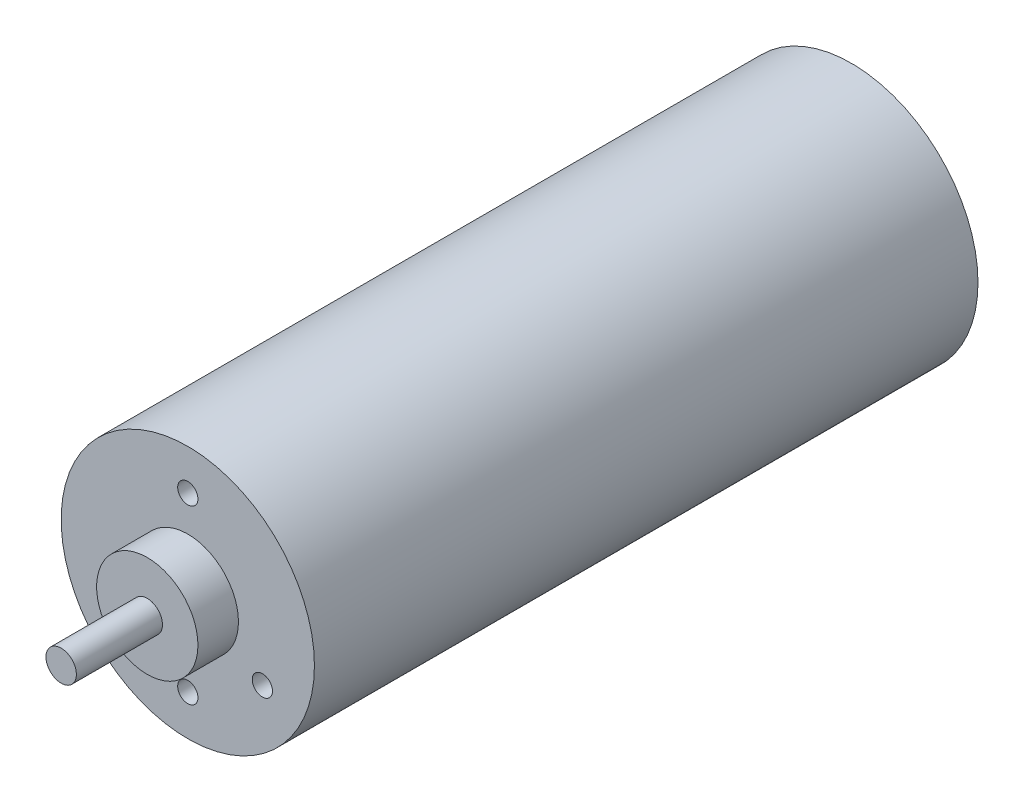
ISO-10303-21;
HEADER;
FILE_DESCRIPTION(('STEP AP214'),'2;1');
FILE_NAME('part.step','',(''),(''),'','','');
FILE_SCHEMA(('AUTOMOTIVE_DESIGN { 1 0 10303 214 1 1 1 1 }'));
ENDSEC;
DATA;
#1=APPLICATION_CONTEXT('core data for automotive mechanical design processes');
#2=APPLICATION_PROTOCOL_DEFINITION('international standard','automotive_design',2000,#1);
#3=PRODUCT_CONTEXT('',#1,'mechanical');
#4=PRODUCT('Part','Part','',(#3));
#5=PRODUCT_RELATED_PRODUCT_CATEGORY('part','',(#4));
#6=PRODUCT_DEFINITION_FORMATION('','',#4);
#7=PRODUCT_DEFINITION_CONTEXT('part definition',#1,'design');
#8=PRODUCT_DEFINITION('design','',#6,#7);
#9=PRODUCT_DEFINITION_SHAPE('','',#8);
#10=(LENGTH_UNIT() NAMED_UNIT(*) SI_UNIT(.MILLI.,.METRE.));
#11=(NAMED_UNIT(*) PLANE_ANGLE_UNIT() SI_UNIT($,.RADIAN.));
#12=(NAMED_UNIT(*) SI_UNIT($,.STERADIAN.) SOLID_ANGLE_UNIT());
#13=UNCERTAINTY_MEASURE_WITH_UNIT(LENGTH_MEASURE(1.E-05),#10,'distance_accuracy_value','');
#14=(GEOMETRIC_REPRESENTATION_CONTEXT(3) GLOBAL_UNCERTAINTY_ASSIGNED_CONTEXT((#13)) GLOBAL_UNIT_ASSIGNED_CONTEXT((#10,
#11,#12)) REPRESENTATION_CONTEXT('',''));
#15=CARTESIAN_POINT('',(0.,0.,0.));
#16=DIRECTION('',(0.,0.,1.));
#17=DIRECTION('',(1.,0.,0.));
#18=AXIS2_PLACEMENT_3D('',#15,#16,#17);
#19=CARTESIAN_POINT('',(0.,0.,69.5));
#20=DIRECTION('',(0.,0.,1.));
#21=DIRECTION('',(1.,0.,0.));
#22=AXIS2_PLACEMENT_3D('',#19,#20,#21);
#23=PLANE('',#22);
#24=CARTESIAN_POINT('',(0.,0.,69.5));
#25=DIRECTION('',(0.,0.,1.));
#26=DIRECTION('',(1.,0.,0.));
#27=AXIS2_PLACEMENT_3D('',#24,#25,#26);
#28=CIRCLE('',#27,5.);
#29=CARTESIAN_POINT('',(5.,0.,69.5));
#30=VERTEX_POINT('',#29);
#31=EDGE_CURVE('E46',#30,#30,#28,.T.);
#32=ORIENTED_EDGE('',*,*,#31,.T.);
#33=EDGE_LOOP('',(#32));
#34=FACE_BOUND('',#33,.T.);
#35=CARTESIAN_POINT('',(0.,0.,69.5));
#36=DIRECTION('',(0.,0.,1.));
#37=DIRECTION('',(1.,0.,0.));
#38=AXIS2_PLACEMENT_3D('',#35,#36,#37);
#39=CIRCLE('',#38,1.5);
#40=CARTESIAN_POINT('',(1.5,0.,69.5));
#41=VERTEX_POINT('',#40);
#42=EDGE_CURVE('E37',#41,#41,#39,.F.);
#43=ORIENTED_EDGE('',*,*,#42,.T.);
#44=EDGE_LOOP('',(#43));
#45=FACE_BOUND('',#44,.T.);
#46=ADVANCED_FACE('F33',(#34,#45),#23,.T.);
#47=CARTESIAN_POINT('',(0.,0.,65.5));
#48=DIRECTION('',(0.,0.,1.));
#49=DIRECTION('',(1.,0.,0.));
#50=AXIS2_PLACEMENT_3D('',#47,#48,#49);
#51=PLANE('',#50);
#52=CARTESIAN_POINT('',(-7.36121593216775,-4.24999999999999,65.5));
#53=DIRECTION('',(0.,0.,1.));
#54=DIRECTION('',(1.,0.,0.));
#55=AXIS2_PLACEMENT_3D('',#52,#53,#54);
#56=CIRCLE('',#55,0.999999999999999);
#57=CARTESIAN_POINT('',(-6.36121593216775,-4.24999999999999,65.5));
#58=VERTEX_POINT('',#57);
#59=EDGE_CURVE('E75',#58,#58,#56,.T.);
#60=ORIENTED_EDGE('',*,*,#59,.F.);
#61=EDGE_LOOP('',(#60));
#62=FACE_BOUND('',#61,.T.);
#63=CARTESIAN_POINT('',(7.36121593216774,-4.24999999999998,65.5));
#64=DIRECTION('',(0.,0.,1.));
#65=DIRECTION('',(1.,0.,0.));
#66=AXIS2_PLACEMENT_3D('',#63,#64,#65);
#67=CIRCLE('',#66,1.);
#68=CARTESIAN_POINT('',(8.36121593216774,-4.24999999999998,65.5));
#69=VERTEX_POINT('',#68);
#70=EDGE_CURVE('E69',#69,#69,#67,.T.);
#71=ORIENTED_EDGE('',*,*,#70,.F.);
#72=EDGE_LOOP('',(#71));
#73=FACE_BOUND('',#72,.T.);
#74=CARTESIAN_POINT('',(0.,-8.5,65.5));
#75=DIRECTION('',(0.,0.,1.));
#76=DIRECTION('',(1.,0.,0.));
#77=AXIS2_PLACEMENT_3D('',#74,#75,#76);
#78=CIRCLE('',#77,1.);
#79=CARTESIAN_POINT('',(1.,-8.5,65.5));
#80=VERTEX_POINT('',#79);
#81=EDGE_CURVE('E63',#80,#80,#78,.T.);
#82=ORIENTED_EDGE('',*,*,#81,.F.);
#83=EDGE_LOOP('',(#82));
#84=FACE_BOUND('',#83,.T.);
#85=CARTESIAN_POINT('',(0.,8.5,65.5));
#86=DIRECTION('',(0.,0.,1.));
#87=DIRECTION('',(1.,0.,0.));
#88=AXIS2_PLACEMENT_3D('',#85,#86,#87);
#89=CIRCLE('',#88,1.);
#90=CARTESIAN_POINT('',(1.,8.5,65.5));
#91=VERTEX_POINT('',#90);
#92=EDGE_CURVE('E57',#91,#91,#89,.T.);
#93=ORIENTED_EDGE('',*,*,#92,.F.);
#94=EDGE_LOOP('',(#93));
#95=FACE_BOUND('',#94,.T.);
#96=CARTESIAN_POINT('',(0.,0.,65.5));
#97=DIRECTION('',(0.,0.,1.));
#98=DIRECTION('',(1.,0.,0.));
#99=AXIS2_PLACEMENT_3D('',#96,#97,#98);
#100=CIRCLE('',#99,12.5);
#101=CARTESIAN_POINT('',(12.5,0.,65.5));
#102=VERTEX_POINT('',#101);
#103=EDGE_CURVE('E10',#102,#102,#100,.T.);
#104=ORIENTED_EDGE('',*,*,#103,.T.);
#105=EDGE_LOOP('',(#104));
#106=FACE_BOUND('',#105,.T.);
#107=CARTESIAN_POINT('',(0.,0.,65.5));
#108=DIRECTION('',(0.,0.,1.));
#109=DIRECTION('',(1.,0.,0.));
#110=AXIS2_PLACEMENT_3D('',#107,#108,#109);
#111=CIRCLE('',#110,5.);
#112=CARTESIAN_POINT('',(5.,0.,65.5));
#113=VERTEX_POINT('',#112);
#114=EDGE_CURVE('E48',#113,#113,#111,.T.);
#115=ORIENTED_EDGE('',*,*,#114,.F.);
#116=EDGE_LOOP('',(#115));
#117=FACE_BOUND('',#116,.T.);
#118=ADVANCED_FACE('F90',(#62,#73,#84,#95,#106,#117),#51,.T.);
#119=CARTESIAN_POINT('',(0.,0.,65.5));
#120=DIRECTION('',(0.,0.,-1.));
#121=DIRECTION('',(-1.,0.,0.));
#122=AXIS2_PLACEMENT_3D('',#119,#120,#121);
#123=CYLINDRICAL_SURFACE('',#122,12.5);
#124=ORIENTED_EDGE('',*,*,#103,.F.);
#125=EDGE_LOOP('',(#124));
#126=FACE_BOUND('',#125,.T.);
#127=CARTESIAN_POINT('',(0.,0.,0.));
#128=DIRECTION('',(0.,0.,1.));
#129=DIRECTION('',(1.,0.,0.));
#130=AXIS2_PLACEMENT_3D('',#127,#128,#129);
#131=CIRCLE('',#130,12.5);
#132=CARTESIAN_POINT('',(12.5,0.,0.));
#133=VERTEX_POINT('',#132);
#134=EDGE_CURVE('E41',#133,#133,#131,.T.);
#135=ORIENTED_EDGE('',*,*,#134,.T.);
#136=EDGE_LOOP('',(#135));
#137=FACE_BOUND('',#136,.T.);
#138=ADVANCED_FACE('F35',(#126,#137),#123,.T.);
#139=CARTESIAN_POINT('',(0.,0.,0.));
#140=DIRECTION('',(0.,0.,1.));
#141=DIRECTION('',(1.,0.,0.));
#142=AXIS2_PLACEMENT_3D('',#139,#140,#141);
#143=PLANE('',#142);
#144=ORIENTED_EDGE('',*,*,#134,.F.);
#145=EDGE_LOOP('',(#144));
#146=FACE_BOUND('',#145,.T.);
#147=ADVANCED_FACE('F105',(#146),#143,.F.);
#148=CARTESIAN_POINT('',(0.,0.,69.5));
#149=DIRECTION('',(0.,0.,-1.));
#150=DIRECTION('',(-1.,0.,0.));
#151=AXIS2_PLACEMENT_3D('',#148,#149,#150);
#152=CYLINDRICAL_SURFACE('',#151,5.);
#153=ORIENTED_EDGE('',*,*,#31,.F.);
#154=EDGE_LOOP('',(#153));
#155=FACE_BOUND('',#154,.T.);
#156=ORIENTED_EDGE('',*,*,#114,.T.);
#157=EDGE_LOOP('',(#156));
#158=FACE_BOUND('',#157,.T.);
#159=ADVANCED_FACE('F102',(#155,#158),#152,.T.);
#160=CARTESIAN_POINT('',(0.,0.,78.));
#161=DIRECTION('',(0.,0.,-1.));
#162=DIRECTION('',(-1.,0.,0.));
#163=AXIS2_PLACEMENT_3D('',#160,#161,#162);
#164=CYLINDRICAL_SURFACE('',#163,1.5);
#165=ORIENTED_EDGE('',*,*,#42,.F.);
#166=EDGE_LOOP('',(#165));
#167=FACE_BOUND('',#166,.T.);
#168=CARTESIAN_POINT('',(0.,0.,78.));
#169=DIRECTION('',(0.,0.,1.));
#170=DIRECTION('',(1.,0.,0.));
#171=AXIS2_PLACEMENT_3D('',#168,#169,#170);
#172=CIRCLE('',#171,1.5);
#173=CARTESIAN_POINT('',(1.5,0.,78.));
#174=VERTEX_POINT('',#173);
#175=EDGE_CURVE('E53',#174,#174,#172,.T.);
#176=ORIENTED_EDGE('',*,*,#175,.F.);
#177=EDGE_LOOP('',(#176));
#178=FACE_BOUND('',#177,.T.);
#179=ADVANCED_FACE('F104',(#167,#178),#164,.T.);
#180=CARTESIAN_POINT('',(0.,0.,78.));
#181=DIRECTION('',(0.,0.,1.));
#182=DIRECTION('',(1.,0.,0.));
#183=AXIS2_PLACEMENT_3D('',#180,#181,#182);
#184=PLANE('',#183);
#185=ORIENTED_EDGE('',*,*,#175,.T.);
#186=EDGE_LOOP('',(#185));
#187=FACE_BOUND('',#186,.T.);
#188=ADVANCED_FACE('F112',(#187),#184,.T.);
#189=CARTESIAN_POINT('',(0.,8.5,55.5));
#190=DIRECTION('',(0.,0.,1.));
#191=DIRECTION('',(1.,0.,0.));
#192=AXIS2_PLACEMENT_3D('',#189,#190,#191);
#193=CYLINDRICAL_SURFACE('',#192,1.);
#194=CARTESIAN_POINT('',(0.,8.5,55.5));
#195=DIRECTION('',(0.,0.,1.));
#196=DIRECTION('',(1.,0.,0.));
#197=AXIS2_PLACEMENT_3D('',#194,#195,#196);
#198=CIRCLE('',#197,1.);
#199=CARTESIAN_POINT('',(1.,8.5,55.5));
#200=VERTEX_POINT('',#199);
#201=EDGE_CURVE('E56',#200,#200,#198,.T.);
#202=ORIENTED_EDGE('',*,*,#201,.F.);
#203=EDGE_LOOP('',(#202));
#204=FACE_BOUND('',#203,.T.);
#205=ORIENTED_EDGE('',*,*,#92,.T.);
#206=EDGE_LOOP('',(#205));
#207=FACE_BOUND('',#206,.T.);
#208=ADVANCED_FACE('F126',(#204,#207),#193,.F.);
#209=CARTESIAN_POINT('',(0.,8.5,55.5));
#210=DIRECTION('',(0.,0.,1.));
#211=DIRECTION('',(1.,0.,0.));
#212=AXIS2_PLACEMENT_3D('',#209,#210,#211);
#213=PLANE('',#212);
#214=ORIENTED_EDGE('',*,*,#201,.T.);
#215=EDGE_LOOP('',(#214));
#216=FACE_BOUND('',#215,.T.);
#217=ADVANCED_FACE('F130',(#216),#213,.T.);
#218=CARTESIAN_POINT('',(0.,-8.5,55.5));
#219=DIRECTION('',(0.,0.,1.));
#220=DIRECTION('',(1.,0.,0.));
#221=AXIS2_PLACEMENT_3D('',#218,#219,#220);
#222=CYLINDRICAL_SURFACE('',#221,1.);
#223=CARTESIAN_POINT('',(0.,-8.5,55.5));
#224=DIRECTION('',(0.,0.,1.));
#225=DIRECTION('',(1.,0.,0.));
#226=AXIS2_PLACEMENT_3D('',#223,#224,#225);
#227=CIRCLE('',#226,1.);
#228=CARTESIAN_POINT('',(1.,-8.5,55.5));
#229=VERTEX_POINT('',#228);
#230=EDGE_CURVE('E60',#229,#229,#227,.T.);
#231=ORIENTED_EDGE('',*,*,#230,.F.);
#232=EDGE_LOOP('',(#231));
#233=FACE_BOUND('',#232,.T.);
#234=ORIENTED_EDGE('',*,*,#81,.T.);
#235=EDGE_LOOP('',(#234));
#236=FACE_BOUND('',#235,.T.);
#237=ADVANCED_FACE('F134',(#233,#236),#222,.F.);
#238=CARTESIAN_POINT('',(0.,-8.5,55.5));
#239=DIRECTION('',(0.,0.,1.));
#240=DIRECTION('',(1.,0.,0.));
#241=AXIS2_PLACEMENT_3D('',#238,#239,#240);
#242=PLANE('',#241);
#243=ORIENTED_EDGE('',*,*,#230,.T.);
#244=EDGE_LOOP('',(#243));
#245=FACE_BOUND('',#244,.T.);
#246=ADVANCED_FACE('F138',(#245),#242,.T.);
#247=CARTESIAN_POINT('',(7.36121593216774,-4.24999999999998,55.5));
#248=DIRECTION('',(0.,0.,1.));
#249=DIRECTION('',(1.,0.,0.));
#250=AXIS2_PLACEMENT_3D('',#247,#248,#249);
#251=CYLINDRICAL_SURFACE('',#250,1.);
#252=CARTESIAN_POINT('',(7.36121593216774,-4.24999999999998,55.5));
#253=DIRECTION('',(0.,0.,1.));
#254=DIRECTION('',(1.,0.,0.));
#255=AXIS2_PLACEMENT_3D('',#252,#253,#254);
#256=CIRCLE('',#255,1.);
#257=CARTESIAN_POINT('',(8.36121593216774,-4.24999999999998,55.5));
#258=VERTEX_POINT('',#257);
#259=EDGE_CURVE('E66',#258,#258,#256,.T.);
#260=ORIENTED_EDGE('',*,*,#259,.F.);
#261=EDGE_LOOP('',(#260));
#262=FACE_BOUND('',#261,.T.);
#263=ORIENTED_EDGE('',*,*,#70,.T.);
#264=EDGE_LOOP('',(#263));
#265=FACE_BOUND('',#264,.T.);
#266=ADVANCED_FACE('F142',(#262,#265),#251,.F.);
#267=CARTESIAN_POINT('',(7.36121593216774,-4.24999999999998,55.5));
#268=DIRECTION('',(0.,0.,1.));
#269=DIRECTION('',(1.,0.,0.));
#270=AXIS2_PLACEMENT_3D('',#267,#268,#269);
#271=PLANE('',#270);
#272=ORIENTED_EDGE('',*,*,#259,.T.);
#273=EDGE_LOOP('',(#272));
#274=FACE_BOUND('',#273,.T.);
#275=ADVANCED_FACE('F86',(#274),#271,.T.);
#276=CARTESIAN_POINT('',(-7.36121593216775,-4.24999999999999,55.5));
#277=DIRECTION('',(0.,0.,1.));
#278=DIRECTION('',(1.,0.,0.));
#279=AXIS2_PLACEMENT_3D('',#276,#277,#278);
#280=CYLINDRICAL_SURFACE('',#279,0.999999999999999);
#281=CARTESIAN_POINT('',(-7.36121593216775,-4.24999999999999,55.5));
#282=DIRECTION('',(0.,0.,1.));
#283=DIRECTION('',(1.,0.,0.));
#284=AXIS2_PLACEMENT_3D('',#281,#282,#283);
#285=CIRCLE('',#284,0.999999999999999);
#286=CARTESIAN_POINT('',(-6.36121593216775,-4.24999999999999,55.5));
#287=VERTEX_POINT('',#286);
#288=EDGE_CURVE('E72',#287,#287,#285,.T.);
#289=ORIENTED_EDGE('',*,*,#288,.F.);
#290=EDGE_LOOP('',(#289));
#291=FACE_BOUND('',#290,.T.);
#292=ORIENTED_EDGE('',*,*,#59,.T.);
#293=EDGE_LOOP('',(#292));
#294=FACE_BOUND('',#293,.T.);
#295=ADVANCED_FACE('F83',(#291,#294),#280,.F.);
#296=CARTESIAN_POINT('',(-7.36121593216775,-4.24999999999999,55.5));
#297=DIRECTION('',(0.,0.,1.));
#298=DIRECTION('',(1.,0.,0.));
#299=AXIS2_PLACEMENT_3D('',#296,#297,#298);
#300=PLANE('',#299);
#301=ORIENTED_EDGE('',*,*,#288,.T.);
#302=EDGE_LOOP('',(#301));
#303=FACE_BOUND('',#302,.T.);
#304=ADVANCED_FACE('F81',(#303),#300,.T.);
#305=CLOSED_SHELL('',(#46,#118,#138,#147,#159,#179,#188,#208,#217,#237,#246,#266,#275,#295,#304));
#306=MANIFOLD_SOLID_BREP('B2',#305);
#307=ADVANCED_BREP_SHAPE_REPRESENTATION('',(#18,#306),#14);
#308=SHAPE_DEFINITION_REPRESENTATION(#9,#307);
ENDSEC;
END-ISO-10303-21;
